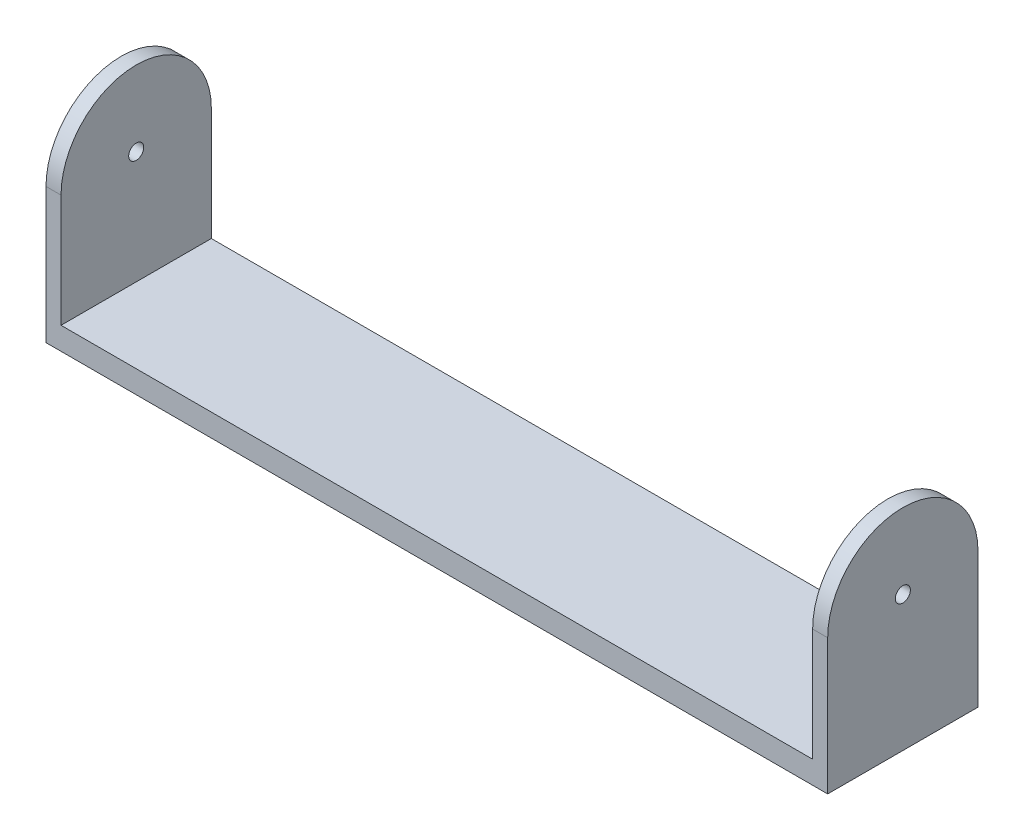
ISO-10303-21;
HEADER;
FILE_DESCRIPTION(('STEP AP214'),'2;1');
FILE_NAME('part.step','',(''),(''),'','','');
FILE_SCHEMA(('AUTOMOTIVE_DESIGN { 1 0 10303 214 1 1 1 1 }'));
ENDSEC;
DATA;
#1=APPLICATION_CONTEXT('core data for automotive mechanical design processes');
#2=APPLICATION_PROTOCOL_DEFINITION('international standard','automotive_design',2000,#1);
#3=PRODUCT_CONTEXT('',#1,'mechanical');
#4=PRODUCT('Part','Part','',(#3));
#5=PRODUCT_RELATED_PRODUCT_CATEGORY('part','',(#4));
#6=PRODUCT_DEFINITION_FORMATION('','',#4);
#7=PRODUCT_DEFINITION_CONTEXT('part definition',#1,'design');
#8=PRODUCT_DEFINITION('design','',#6,#7);
#9=PRODUCT_DEFINITION_SHAPE('','',#8);
#10=(LENGTH_UNIT() NAMED_UNIT(*) SI_UNIT(.MILLI.,.METRE.));
#11=(NAMED_UNIT(*) PLANE_ANGLE_UNIT() SI_UNIT($,.RADIAN.));
#12=(NAMED_UNIT(*) SI_UNIT($,.STERADIAN.) SOLID_ANGLE_UNIT());
#13=UNCERTAINTY_MEASURE_WITH_UNIT(LENGTH_MEASURE(1.E-05),#10,'distance_accuracy_value','');
#14=(GEOMETRIC_REPRESENTATION_CONTEXT(3) GLOBAL_UNCERTAINTY_ASSIGNED_CONTEXT((#13)) GLOBAL_UNIT_ASSIGNED_CONTEXT((#10,
#11,#12)) REPRESENTATION_CONTEXT('',''));
#15=CARTESIAN_POINT('',(0.,0.,0.));
#16=DIRECTION('',(0.,0.,1.));
#17=DIRECTION('',(1.,0.,0.));
#18=AXIS2_PLACEMENT_3D('',#15,#16,#17);
#19=CARTESIAN_POINT('',(0.,0.,200.));
#20=DIRECTION('',(1.,0.,0.));
#21=DIRECTION('',(0.,1.,0.));
#22=AXIS2_PLACEMENT_3D('',#19,#20,#21);
#23=PLANE('',#22);
#24=CARTESIAN_POINT('',(0.,150.,100.));
#25=DIRECTION('',(1.,0.,0.));
#26=DIRECTION('',(0.,1.,0.));
#27=AXIS2_PLACEMENT_3D('',#24,#25,#26);
#28=CIRCLE('',#27,10.);
#29=CARTESIAN_POINT('',(0.,160.,100.));
#30=VERTEX_POINT('',#29);
#31=EDGE_CURVE('E188',#30,#30,#28,.T.);
#32=ORIENTED_EDGE('',*,*,#31,.T.);
#33=EDGE_LOOP('',(#32));
#34=FACE_BOUND('',#33,.T.);
#35=DIRECTION('',(0.,-1.,0.));
#36=VECTOR('',#35,1.);
#37=CARTESIAN_POINT('',(0.,0.,0.));
#38=LINE('',#37,#36);
#39=CARTESIAN_POINT('',(0.,150.,0.));
#40=VERTEX_POINT('',#39);
#41=CARTESIAN_POINT('',(0.,-30.,0.));
#42=VERTEX_POINT('',#41);
#43=EDGE_CURVE('E147',#40,#42,#38,.T.);
#44=ORIENTED_EDGE('',*,*,#43,.T.);
#45=DIRECTION('',(0.,0.,-1.));
#46=VECTOR('',#45,1.);
#47=CARTESIAN_POINT('',(0.,-30.,200.));
#48=LINE('',#47,#46);
#49=CARTESIAN_POINT('',(0.,-30.,200.));
#50=VERTEX_POINT('',#49);
#51=EDGE_CURVE('E11',#50,#42,#48,.T.);
#52=ORIENTED_EDGE('',*,*,#51,.F.);
#53=DIRECTION('',(0.,-1.,0.));
#54=VECTOR('',#53,1.);
#55=CARTESIAN_POINT('',(0.,0.,200.));
#56=LINE('',#55,#54);
#57=CARTESIAN_POINT('',(0.,150.,200.));
#58=VERTEX_POINT('',#57);
#59=EDGE_CURVE('E150',#58,#50,#56,.T.);
#60=ORIENTED_EDGE('',*,*,#59,.F.);
#61=CARTESIAN_POINT('',(0.,150.,100.));
#62=DIRECTION('',(1.,0.,0.));
#63=DIRECTION('',(0.,0.,1.));
#64=AXIS2_PLACEMENT_3D('',#61,#62,#63);
#65=CIRCLE('',#64,100.);
#66=EDGE_CURVE('E114',#40,#58,#65,.T.);
#67=ORIENTED_EDGE('',*,*,#66,.F.);
#68=EDGE_LOOP('',(#44,#52,#60,#67));
#69=FACE_BOUND('',#68,.T.);
#70=ADVANCED_FACE('F33',(#34,#69),#23,.F.);
#71=CARTESIAN_POINT('',(0.,-30.,200.));
#72=DIRECTION('',(0.,1.,0.));
#73=DIRECTION('',(0.,0.,1.));
#74=AXIS2_PLACEMENT_3D('',#71,#72,#73);
#75=PLANE('',#74);
#76=DIRECTION('',(1.,0.,0.));
#77=VECTOR('',#76,1.);
#78=CARTESIAN_POINT('',(0.,-30.,0.));
#79=LINE('',#78,#77);
#80=CARTESIAN_POINT('',(1040.,-30.,0.));
#81=VERTEX_POINT('',#80);
#82=EDGE_CURVE('E159',#42,#81,#79,.T.);
#83=ORIENTED_EDGE('',*,*,#82,.T.);
#84=DIRECTION('',(0.,0.,-1.));
#85=VECTOR('',#84,1.);
#86=CARTESIAN_POINT('',(1040.,-30.,200.));
#87=LINE('',#86,#85);
#88=CARTESIAN_POINT('',(1040.,-30.,200.));
#89=VERTEX_POINT('',#88);
#90=EDGE_CURVE('E41',#89,#81,#87,.T.);
#91=ORIENTED_EDGE('',*,*,#90,.F.);
#92=DIRECTION('',(1.,0.,0.));
#93=VECTOR('',#92,1.);
#94=CARTESIAN_POINT('',(0.,-30.,200.));
#95=LINE('',#94,#93);
#96=EDGE_CURVE('E152',#50,#89,#95,.T.);
#97=ORIENTED_EDGE('',*,*,#96,.F.);
#98=ORIENTED_EDGE('',*,*,#51,.T.);
#99=EDGE_LOOP('',(#83,#91,#97,#98));
#100=FACE_BOUND('',#99,.T.);
#101=ADVANCED_FACE('F179',(#100),#75,.F.);
#102=CARTESIAN_POINT('',(1040.,0.,200.));
#103=DIRECTION('',(-1.,0.,0.));
#104=DIRECTION('',(0.,0.,1.));
#105=AXIS2_PLACEMENT_3D('',#102,#103,#104);
#106=PLANE('',#105);
#107=CARTESIAN_POINT('',(1040.,150.,100.));
#108=DIRECTION('',(1.,0.,0.));
#109=DIRECTION('',(0.,1.,0.));
#110=AXIS2_PLACEMENT_3D('',#107,#108,#109);
#111=CIRCLE('',#110,10.);
#112=CARTESIAN_POINT('',(1040.,160.,100.));
#113=VERTEX_POINT('',#112);
#114=EDGE_CURVE('E190',#113,#113,#111,.T.);
#115=ORIENTED_EDGE('',*,*,#114,.F.);
#116=EDGE_LOOP('',(#115));
#117=FACE_BOUND('',#116,.T.);
#118=DIRECTION('',(0.,1.,0.));
#119=VECTOR('',#118,1.);
#120=CARTESIAN_POINT('',(1040.,0.,0.));
#121=LINE('',#120,#119);
#122=CARTESIAN_POINT('',(1040.,150.,0.));
#123=VERTEX_POINT('',#122);
#124=EDGE_CURVE('E161',#81,#123,#121,.T.);
#125=ORIENTED_EDGE('',*,*,#124,.T.);
#126=CARTESIAN_POINT('',(1040.,150.,100.));
#127=DIRECTION('',(1.,0.,0.));
#128=DIRECTION('',(0.,0.,1.));
#129=AXIS2_PLACEMENT_3D('',#126,#127,#128);
#130=CIRCLE('',#129,100.);
#131=CARTESIAN_POINT('',(1040.,150.,200.));
#132=VERTEX_POINT('',#131);
#133=EDGE_CURVE('E129',#123,#132,#130,.T.);
#134=ORIENTED_EDGE('',*,*,#133,.T.);
#135=DIRECTION('',(0.,1.,0.));
#136=VECTOR('',#135,1.);
#137=CARTESIAN_POINT('',(1040.,0.,200.));
#138=LINE('',#137,#136);
#139=EDGE_CURVE('E154',#89,#132,#138,.T.);
#140=ORIENTED_EDGE('',*,*,#139,.F.);
#141=ORIENTED_EDGE('',*,*,#90,.T.);
#142=EDGE_LOOP('',(#125,#134,#140,#141));
#143=FACE_BOUND('',#142,.T.);
#144=ADVANCED_FACE('F169',(#117,#143),#106,.F.);
#145=CARTESIAN_POINT('',(0.,0.,200.));
#146=DIRECTION('',(0.,-1.,0.));
#147=DIRECTION('',(0.,0.,-1.));
#148=AXIS2_PLACEMENT_3D('',#145,#146,#147);
#149=PLANE('',#148);
#150=DIRECTION('',(-1.,0.,0.));
#151=VECTOR('',#150,1.);
#152=CARTESIAN_POINT('',(0.,0.,0.));
#153=LINE('',#152,#151);
#154=CARTESIAN_POINT('',(1020.,0.,0.));
#155=VERTEX_POINT('',#154);
#156=CARTESIAN_POINT('',(20.,0.,0.));
#157=VERTEX_POINT('',#156);
#158=EDGE_CURVE('E53',#155,#157,#153,.T.);
#159=ORIENTED_EDGE('',*,*,#158,.T.);
#160=DIRECTION('',(0.,0.,-1.));
#161=VECTOR('',#160,1.);
#162=CARTESIAN_POINT('',(20.,0.,0.));
#163=LINE('',#162,#161);
#164=CARTESIAN_POINT('',(20.,0.,200.));
#165=VERTEX_POINT('',#164);
#166=EDGE_CURVE('E48',#165,#157,#163,.T.);
#167=ORIENTED_EDGE('',*,*,#166,.F.);
#168=DIRECTION('',(-1.,0.,0.));
#169=VECTOR('',#168,1.);
#170=CARTESIAN_POINT('',(0.,0.,200.));
#171=LINE('',#170,#169);
#172=CARTESIAN_POINT('',(1020.,0.,200.));
#173=VERTEX_POINT('',#172);
#174=EDGE_CURVE('E121',#173,#165,#171,.T.);
#175=ORIENTED_EDGE('',*,*,#174,.F.);
#176=DIRECTION('',(0.,0.,-1.));
#177=VECTOR('',#176,1.);
#178=CARTESIAN_POINT('',(1020.,0.,0.));
#179=LINE('',#178,#177);
#180=EDGE_CURVE('E131',#173,#155,#179,.T.);
#181=ORIENTED_EDGE('',*,*,#180,.T.);
#182=EDGE_LOOP('',(#159,#167,#175,#181));
#183=FACE_BOUND('',#182,.T.);
#184=ADVANCED_FACE('F205',(#183),#149,.F.);
#185=CARTESIAN_POINT('',(0.,0.,200.));
#186=DIRECTION('',(0.,0.,1.));
#187=DIRECTION('',(1.,0.,0.));
#188=AXIS2_PLACEMENT_3D('',#185,#186,#187);
#189=PLANE('',#188);
#190=ORIENTED_EDGE('',*,*,#59,.T.);
#191=ORIENTED_EDGE('',*,*,#96,.T.);
#192=ORIENTED_EDGE('',*,*,#139,.T.);
#193=DIRECTION('',(1.,0.,0.));
#194=VECTOR('',#193,1.);
#195=CARTESIAN_POINT('',(1020.,150.,200.));
#196=LINE('',#195,#194);
#197=CARTESIAN_POINT('',(1020.,150.,200.));
#198=VERTEX_POINT('',#197);
#199=EDGE_CURVE('E144',#198,#132,#196,.T.);
#200=ORIENTED_EDGE('',*,*,#199,.F.);
#201=DIRECTION('',(0.,-1.,0.));
#202=VECTOR('',#201,1.);
#203=CARTESIAN_POINT('',(1020.,0.,200.));
#204=LINE('',#203,#202);
#205=EDGE_CURVE('E139',#198,#173,#204,.T.);
#206=ORIENTED_EDGE('',*,*,#205,.T.);
#207=ORIENTED_EDGE('',*,*,#174,.T.);
#208=DIRECTION('',(0.,-1.,0.));
#209=VECTOR('',#208,1.);
#210=CARTESIAN_POINT('',(20.,0.,200.));
#211=LINE('',#210,#209);
#212=CARTESIAN_POINT('',(20.,150.,200.));
#213=VERTEX_POINT('',#212);
#214=EDGE_CURVE('E103',#213,#165,#211,.T.);
#215=ORIENTED_EDGE('',*,*,#214,.F.);
#216=DIRECTION('',(-1.,0.,0.));
#217=VECTOR('',#216,1.);
#218=CARTESIAN_POINT('',(20.,150.,200.));
#219=LINE('',#218,#217);
#220=EDGE_CURVE('E111',#213,#58,#219,.T.);
#221=ORIENTED_EDGE('',*,*,#220,.T.);
#222=EDGE_LOOP('',(#190,#191,#192,#200,#206,#207,#215,#221));
#223=FACE_BOUND('',#222,.T.);
#224=ADVANCED_FACE('F119',(#223),#189,.T.);
#225=CARTESIAN_POINT('',(0.,0.,0.));
#226=DIRECTION('',(0.,0.,1.));
#227=DIRECTION('',(1.,0.,0.));
#228=AXIS2_PLACEMENT_3D('',#225,#226,#227);
#229=PLANE('',#228);
#230=ORIENTED_EDGE('',*,*,#43,.F.);
#231=DIRECTION('',(-1.,0.,0.));
#232=VECTOR('',#231,1.);
#233=CARTESIAN_POINT('',(20.,150.,0.));
#234=LINE('',#233,#232);
#235=CARTESIAN_POINT('',(20.,150.,0.));
#236=VERTEX_POINT('',#235);
#237=EDGE_CURVE('E117',#236,#40,#234,.T.);
#238=ORIENTED_EDGE('',*,*,#237,.F.);
#239=DIRECTION('',(0.,1.,0.));
#240=VECTOR('',#239,1.);
#241=CARTESIAN_POINT('',(20.,150.,0.));
#242=LINE('',#241,#240);
#243=EDGE_CURVE('E104',#157,#236,#242,.T.);
#244=ORIENTED_EDGE('',*,*,#243,.F.);
#245=ORIENTED_EDGE('',*,*,#158,.F.);
#246=DIRECTION('',(0.,1.,0.));
#247=VECTOR('',#246,1.);
#248=CARTESIAN_POINT('',(1020.,150.,0.));
#249=LINE('',#248,#247);
#250=CARTESIAN_POINT('',(1020.,150.,0.));
#251=VERTEX_POINT('',#250);
#252=EDGE_CURVE('E133',#155,#251,#249,.T.);
#253=ORIENTED_EDGE('',*,*,#252,.T.);
#254=DIRECTION('',(1.,0.,0.));
#255=VECTOR('',#254,1.);
#256=CARTESIAN_POINT('',(1020.,150.,0.));
#257=LINE('',#256,#255);
#258=EDGE_CURVE('E141',#251,#123,#257,.T.);
#259=ORIENTED_EDGE('',*,*,#258,.T.);
#260=ORIENTED_EDGE('',*,*,#124,.F.);
#261=ORIENTED_EDGE('',*,*,#82,.F.);
#262=EDGE_LOOP('',(#230,#238,#244,#245,#253,#259,#260,#261));
#263=FACE_BOUND('',#262,.T.);
#264=ADVANCED_FACE('F172',(#263),#229,.F.);
#265=CARTESIAN_POINT('',(1020.,150.,100.));
#266=DIRECTION('',(1.,0.,0.));
#267=DIRECTION('',(0.,0.,-1.));
#268=AXIS2_PLACEMENT_3D('',#265,#266,#267);
#269=CYLINDRICAL_SURFACE('',#268,100.);
#270=ORIENTED_EDGE('',*,*,#133,.F.);
#271=ORIENTED_EDGE('',*,*,#258,.F.);
#272=CARTESIAN_POINT('',(1020.,150.,100.));
#273=DIRECTION('',(1.,0.,0.));
#274=DIRECTION('',(0.,0.,1.));
#275=AXIS2_PLACEMENT_3D('',#272,#273,#274);
#276=CIRCLE('',#275,100.);
#277=EDGE_CURVE('E136',#251,#198,#276,.T.);
#278=ORIENTED_EDGE('',*,*,#277,.T.);
#279=ORIENTED_EDGE('',*,*,#199,.T.);
#280=EDGE_LOOP('',(#270,#271,#278,#279));
#281=FACE_BOUND('',#280,.T.);
#282=ADVANCED_FACE('F176',(#281),#269,.T.);
#283=CARTESIAN_POINT('',(1020.,150.,100.));
#284=DIRECTION('',(-1.,0.,0.));
#285=DIRECTION('',(0.,0.,1.));
#286=AXIS2_PLACEMENT_3D('',#283,#284,#285);
#287=PLANE('',#286);
#288=CARTESIAN_POINT('',(1020.,150.,100.));
#289=DIRECTION('',(-1.,0.,0.));
#290=DIRECTION('',(0.,0.,1.));
#291=AXIS2_PLACEMENT_3D('',#288,#289,#290);
#292=CIRCLE('',#291,10.);
#293=CARTESIAN_POINT('',(1020.,150.,110.));
#294=VERTEX_POINT('',#293);
#295=EDGE_CURVE('E128',#294,#294,#292,.T.);
#296=ORIENTED_EDGE('',*,*,#295,.F.);
#297=EDGE_LOOP('',(#296));
#298=FACE_BOUND('',#297,.T.);
#299=ORIENTED_EDGE('',*,*,#180,.F.);
#300=ORIENTED_EDGE('',*,*,#205,.F.);
#301=ORIENTED_EDGE('',*,*,#277,.F.);
#302=ORIENTED_EDGE('',*,*,#252,.F.);
#303=EDGE_LOOP('',(#299,#300,#301,#302));
#304=FACE_BOUND('',#303,.T.);
#305=ADVANCED_FACE('F201',(#298,#304),#287,.T.);
#306=CARTESIAN_POINT('',(20.,150.,100.));
#307=DIRECTION('',(-1.,0.,0.));
#308=DIRECTION('',(0.,-1.,0.));
#309=AXIS2_PLACEMENT_3D('',#306,#307,#308);
#310=CYLINDRICAL_SURFACE('',#309,100.);
#311=ORIENTED_EDGE('',*,*,#66,.T.);
#312=ORIENTED_EDGE('',*,*,#220,.F.);
#313=CARTESIAN_POINT('',(20.,150.,100.));
#314=DIRECTION('',(1.,0.,0.));
#315=DIRECTION('',(0.,0.,1.));
#316=AXIS2_PLACEMENT_3D('',#313,#314,#315);
#317=CIRCLE('',#316,100.);
#318=EDGE_CURVE('E99',#236,#213,#317,.T.);
#319=ORIENTED_EDGE('',*,*,#318,.F.);
#320=ORIENTED_EDGE('',*,*,#237,.T.);
#321=EDGE_LOOP('',(#311,#312,#319,#320));
#322=FACE_BOUND('',#321,.T.);
#323=ADVANCED_FACE('F112',(#322),#310,.T.);
#324=CARTESIAN_POINT('',(20.,150.,100.));
#325=DIRECTION('',(1.,0.,0.));
#326=DIRECTION('',(0.,0.,1.));
#327=AXIS2_PLACEMENT_3D('',#324,#325,#326);
#328=PLANE('',#327);
#329=CARTESIAN_POINT('',(20.,150.,100.));
#330=DIRECTION('',(1.,0.,0.));
#331=DIRECTION('',(0.,1.,0.));
#332=AXIS2_PLACEMENT_3D('',#329,#330,#331);
#333=CIRCLE('',#332,10.);
#334=CARTESIAN_POINT('',(20.,160.,100.));
#335=VERTEX_POINT('',#334);
#336=EDGE_CURVE('E36',#335,#335,#333,.T.);
#337=ORIENTED_EDGE('',*,*,#336,.F.);
#338=EDGE_LOOP('',(#337));
#339=FACE_BOUND('',#338,.T.);
#340=ORIENTED_EDGE('',*,*,#166,.T.);
#341=ORIENTED_EDGE('',*,*,#243,.T.);
#342=ORIENTED_EDGE('',*,*,#318,.T.);
#343=ORIENTED_EDGE('',*,*,#214,.T.);
#344=EDGE_LOOP('',(#340,#341,#342,#343));
#345=FACE_BOUND('',#344,.T.);
#346=ADVANCED_FACE('F101',(#339,#345),#328,.T.);
#347=CARTESIAN_POINT('',(0.,150.,100.));
#348=DIRECTION('',(1.,0.,0.));
#349=DIRECTION('',(0.,1.,0.));
#350=AXIS2_PLACEMENT_3D('',#347,#348,#349);
#351=CYLINDRICAL_SURFACE('',#350,10.);
#352=ORIENTED_EDGE('',*,*,#336,.T.);
#353=EDGE_LOOP('',(#352));
#354=FACE_BOUND('',#353,.T.);
#355=ORIENTED_EDGE('',*,*,#31,.F.);
#356=EDGE_LOOP('',(#355));
#357=FACE_BOUND('',#356,.T.);
#358=ADVANCED_FACE('F224',(#354,#357),#351,.F.);
#359=ORIENTED_EDGE('',*,*,#295,.T.);
#360=EDGE_LOOP('',(#359));
#361=FACE_BOUND('',#360,.T.);
#362=ORIENTED_EDGE('',*,*,#114,.T.);
#363=EDGE_LOOP('',(#362));
#364=FACE_BOUND('',#363,.T.);
#365=ADVANCED_FACE('F198',(#361,#364),#351,.F.);
#366=CLOSED_SHELL('',(#70,#101,#144,#184,#224,#264,#282,#305,#323,#346,#358,#365));
#367=MANIFOLD_SOLID_BREP('B2',#366);
#368=ADVANCED_BREP_SHAPE_REPRESENTATION('',(#18,#367),#14);
#369=SHAPE_DEFINITION_REPRESENTATION(#9,#368);
ENDSEC;
END-ISO-10303-21;
